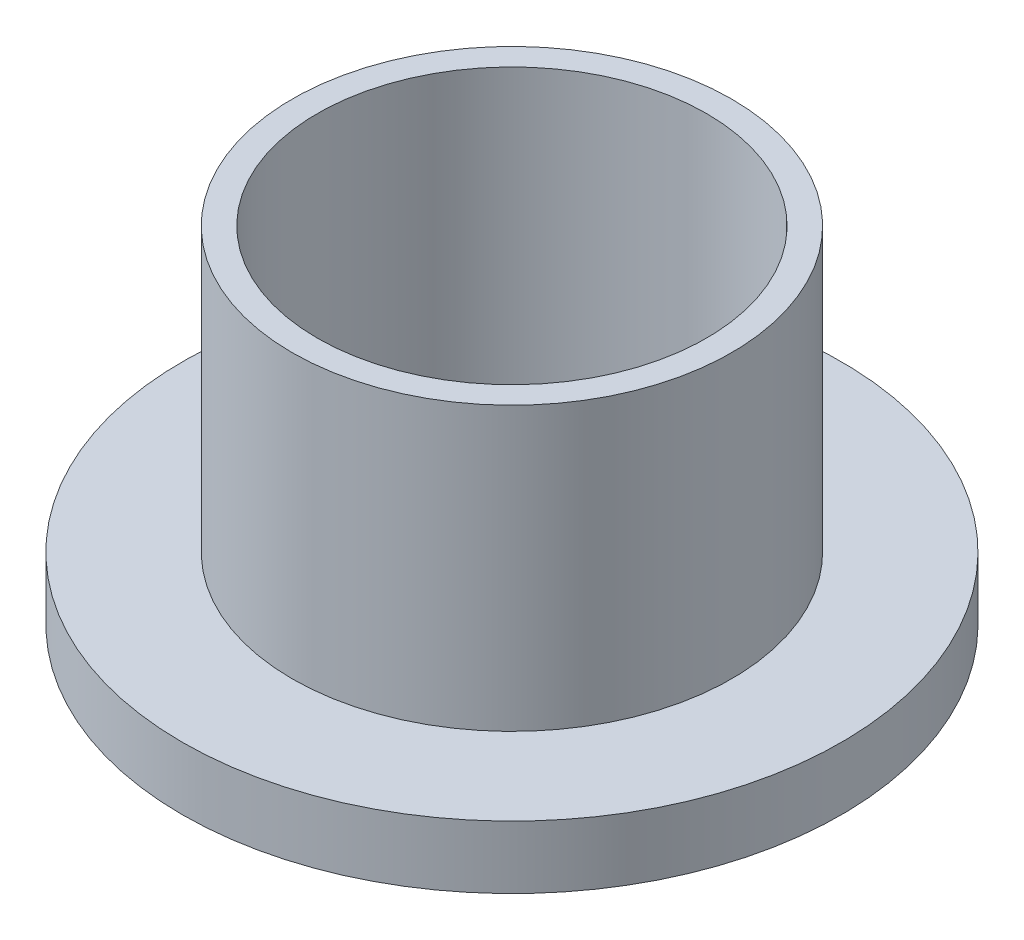
ISO-10303-21;
HEADER;
FILE_DESCRIPTION(('STEP AP214'),'2;1');
FILE_NAME('part.step','',(''),(''),'','','');
FILE_SCHEMA(('AUTOMOTIVE_DESIGN { 1 0 10303 214 1 1 1 1 }'));
ENDSEC;
DATA;
#1=APPLICATION_CONTEXT('core data for automotive mechanical design processes');
#2=APPLICATION_PROTOCOL_DEFINITION('international standard','automotive_design',2000,#1);
#3=PRODUCT_CONTEXT('',#1,'mechanical');
#4=PRODUCT('Part','Part','',(#3));
#5=PRODUCT_RELATED_PRODUCT_CATEGORY('part','',(#4));
#6=PRODUCT_DEFINITION_FORMATION('','',#4);
#7=PRODUCT_DEFINITION_CONTEXT('part definition',#1,'design');
#8=PRODUCT_DEFINITION('design','',#6,#7);
#9=PRODUCT_DEFINITION_SHAPE('','',#8);
#10=(LENGTH_UNIT() NAMED_UNIT(*) SI_UNIT(.MILLI.,.METRE.));
#11=(NAMED_UNIT(*) PLANE_ANGLE_UNIT() SI_UNIT($,.RADIAN.));
#12=(NAMED_UNIT(*) SI_UNIT($,.STERADIAN.) SOLID_ANGLE_UNIT());
#13=UNCERTAINTY_MEASURE_WITH_UNIT(LENGTH_MEASURE(1.E-05),#10,'distance_accuracy_value','');
#14=(GEOMETRIC_REPRESENTATION_CONTEXT(3) GLOBAL_UNCERTAINTY_ASSIGNED_CONTEXT((#13)) GLOBAL_UNIT_ASSIGNED_CONTEXT((#10,
#11,#12)) REPRESENTATION_CONTEXT('',''));
#15=CARTESIAN_POINT('',(0.,0.,0.));
#16=DIRECTION('',(0.,0.,1.));
#17=DIRECTION('',(1.,0.,0.));
#18=AXIS2_PLACEMENT_3D('',#15,#16,#17);
#19=CARTESIAN_POINT('',(0.,1.,0.));
#20=DIRECTION('',(0.,1.,0.));
#21=DIRECTION('',(0.,0.,1.));
#22=AXIS2_PLACEMENT_3D('',#19,#20,#21);
#23=PLANE('',#22);
#24=CARTESIAN_POINT('',(0.,1.,0.));
#25=DIRECTION('',(0.,1.,0.));
#26=DIRECTION('',(0.,0.,1.));
#27=AXIS2_PLACEMENT_3D('',#24,#25,#26);
#28=CIRCLE('',#27,2.5);
#29=CARTESIAN_POINT('',(0.,1.,2.5));
#30=VERTEX_POINT('',#29);
#31=EDGE_CURVE('E55',#30,#30,#28,.T.);
#32=ORIENTED_EDGE('',*,*,#31,.F.);
#33=EDGE_LOOP('',(#32));
#34=FACE_BOUND('',#33,.T.);
#35=CARTESIAN_POINT('',(0.,1.,0.));
#36=DIRECTION('',(0.,1.,0.));
#37=DIRECTION('',(0.,0.,1.));
#38=AXIS2_PLACEMENT_3D('',#35,#36,#37);
#39=CIRCLE('',#38,3.1);
#40=CARTESIAN_POINT('',(0.,1.,3.1));
#41=VERTEX_POINT('',#40);
#42=EDGE_CURVE('E10',#41,#41,#39,.F.);
#43=ORIENTED_EDGE('',*,*,#42,.F.);
#44=EDGE_LOOP('',(#43));
#45=FACE_BOUND('',#44,.T.);
#46=ADVANCED_FACE('F37',(#34,#45),#23,.T.);
#47=CARTESIAN_POINT('',(0.,1.,0.));
#48=DIRECTION('',(0.,-1.,0.));
#49=DIRECTION('',(0.,0.,-1.));
#50=AXIS2_PLACEMENT_3D('',#47,#48,#49);
#51=CYLINDRICAL_SURFACE('',#50,5.25);
#52=CARTESIAN_POINT('',(0.,1.,0.));
#53=DIRECTION('',(0.,1.,0.));
#54=DIRECTION('',(0.,0.,1.));
#55=AXIS2_PLACEMENT_3D('',#52,#53,#54);
#56=CIRCLE('',#55,5.25);
#57=CARTESIAN_POINT('',(0.,1.,5.25));
#58=VERTEX_POINT('',#57);
#59=EDGE_CURVE('E44',#58,#58,#56,.T.);
#60=ORIENTED_EDGE('',*,*,#59,.F.);
#61=EDGE_LOOP('',(#60));
#62=FACE_BOUND('',#61,.T.);
#63=CARTESIAN_POINT('',(0.,0.,0.));
#64=DIRECTION('',(0.,1.,0.));
#65=DIRECTION('',(0.,0.,1.));
#66=AXIS2_PLACEMENT_3D('',#63,#64,#65);
#67=CIRCLE('',#66,5.25);
#68=CARTESIAN_POINT('',(0.,0.,5.25));
#69=VERTEX_POINT('',#68);
#70=EDGE_CURVE('E48',#69,#69,#67,.T.);
#71=ORIENTED_EDGE('',*,*,#70,.T.);
#72=EDGE_LOOP('',(#71));
#73=FACE_BOUND('',#72,.T.);
#74=ADVANCED_FACE('F39',(#62,#73),#51,.T.);
#75=CARTESIAN_POINT('',(0.,1.,0.));
#76=DIRECTION('',(0.,1.,0.));
#77=DIRECTION('',(0.,0.,1.));
#78=AXIS2_PLACEMENT_3D('',#75,#76,#77);
#79=CIRCLE('',#78,3.5);
#80=CARTESIAN_POINT('',(0.,1.,3.5));
#81=VERTEX_POINT('',#80);
#82=EDGE_CURVE('E61',#81,#81,#79,.T.);
#83=ORIENTED_EDGE('',*,*,#82,.F.);
#84=EDGE_LOOP('',(#83));
#85=FACE_BOUND('',#84,.T.);
#86=ORIENTED_EDGE('',*,*,#59,.T.);
#87=EDGE_LOOP('',(#86));
#88=FACE_BOUND('',#87,.T.);
#89=ADVANCED_FACE('F92',(#85,#88),#23,.T.);
#90=CARTESIAN_POINT('',(0.,0.,0.));
#91=DIRECTION('',(0.,1.,0.));
#92=DIRECTION('',(0.,0.,1.));
#93=AXIS2_PLACEMENT_3D('',#90,#91,#92);
#94=PLANE('',#93);
#95=CARTESIAN_POINT('',(0.,0.,0.));
#96=DIRECTION('',(0.,1.,0.));
#97=DIRECTION('',(0.,0.,1.));
#98=AXIS2_PLACEMENT_3D('',#95,#96,#97);
#99=CIRCLE('',#98,2.5);
#100=CARTESIAN_POINT('',(0.,0.,2.5));
#101=VERTEX_POINT('',#100);
#102=EDGE_CURVE('E53',#101,#101,#99,.T.);
#103=ORIENTED_EDGE('',*,*,#102,.T.);
#104=EDGE_LOOP('',(#103));
#105=FACE_BOUND('',#104,.T.);
#106=ORIENTED_EDGE('',*,*,#70,.F.);
#107=EDGE_LOOP('',(#106));
#108=FACE_BOUND('',#107,.T.);
#109=ADVANCED_FACE('F85',(#105,#108),#94,.F.);
#110=CARTESIAN_POINT('',(0.,0.,0.));
#111=DIRECTION('',(0.,1.,0.));
#112=DIRECTION('',(0.,0.,1.));
#113=AXIS2_PLACEMENT_3D('',#110,#111,#112);
#114=CYLINDRICAL_SURFACE('',#113,2.5);
#115=ORIENTED_EDGE('',*,*,#102,.F.);
#116=EDGE_LOOP('',(#115));
#117=FACE_BOUND('',#116,.T.);
#118=ORIENTED_EDGE('',*,*,#31,.T.);
#119=EDGE_LOOP('',(#118));
#120=FACE_BOUND('',#119,.T.);
#121=ADVANCED_FACE('F75',(#117,#120),#114,.F.);
#122=CARTESIAN_POINT('',(0.,5.5,0.));
#123=DIRECTION('',(0.,1.,0.));
#124=DIRECTION('',(0.,0.,1.));
#125=AXIS2_PLACEMENT_3D('',#122,#123,#124);
#126=PLANE('',#125);
#127=CARTESIAN_POINT('',(0.,5.5,0.));
#128=DIRECTION('',(0.,1.,0.));
#129=DIRECTION('',(0.,0.,1.));
#130=AXIS2_PLACEMENT_3D('',#127,#128,#129);
#131=CIRCLE('',#130,3.5);
#132=CARTESIAN_POINT('',(0.,5.5,3.5));
#133=VERTEX_POINT('',#132);
#134=EDGE_CURVE('E58',#133,#133,#131,.T.);
#135=ORIENTED_EDGE('',*,*,#134,.T.);
#136=EDGE_LOOP('',(#135));
#137=FACE_BOUND('',#136,.T.);
#138=CARTESIAN_POINT('',(0.,5.5,0.));
#139=DIRECTION('',(0.,1.,0.));
#140=DIRECTION('',(0.,0.,1.));
#141=AXIS2_PLACEMENT_3D('',#138,#139,#140);
#142=CIRCLE('',#141,3.1);
#143=CARTESIAN_POINT('',(0.,5.5,3.1));
#144=VERTEX_POINT('',#143);
#145=EDGE_CURVE('E64',#144,#144,#142,.T.);
#146=ORIENTED_EDGE('',*,*,#145,.F.);
#147=EDGE_LOOP('',(#146));
#148=FACE_BOUND('',#147,.T.);
#149=ADVANCED_FACE('F72',(#137,#148),#126,.T.);
#150=CARTESIAN_POINT('',(0.,5.5,0.));
#151=DIRECTION('',(0.,-1.,0.));
#152=DIRECTION('',(0.,0.,-1.));
#153=AXIS2_PLACEMENT_3D('',#150,#151,#152);
#154=CYLINDRICAL_SURFACE('',#153,3.5);
#155=ORIENTED_EDGE('',*,*,#134,.F.);
#156=EDGE_LOOP('',(#155));
#157=FACE_BOUND('',#156,.T.);
#158=ORIENTED_EDGE('',*,*,#82,.T.);
#159=EDGE_LOOP('',(#158));
#160=FACE_BOUND('',#159,.T.);
#161=ADVANCED_FACE('F74',(#157,#160),#154,.T.);
#162=CARTESIAN_POINT('',(0.,5.5,0.));
#163=DIRECTION('',(0.,-1.,0.));
#164=DIRECTION('',(0.,0.,-1.));
#165=AXIS2_PLACEMENT_3D('',#162,#163,#164);
#166=CYLINDRICAL_SURFACE('',#165,3.1);
#167=ORIENTED_EDGE('',*,*,#145,.T.);
#168=EDGE_LOOP('',(#167));
#169=FACE_BOUND('',#168,.T.);
#170=ORIENTED_EDGE('',*,*,#42,.T.);
#171=EDGE_LOOP('',(#170));
#172=FACE_BOUND('',#171,.T.);
#173=ADVANCED_FACE('F70',(#169,#172),#166,.F.);
#174=CLOSED_SHELL('',(#46,#74,#89,#109,#121,#149,#161,#173));
#175=MANIFOLD_SOLID_BREP('B2',#174);
#176=ADVANCED_BREP_SHAPE_REPRESENTATION('',(#18,#175),#14);
#177=SHAPE_DEFINITION_REPRESENTATION(#9,#176);
ENDSEC;
END-ISO-10303-21;
